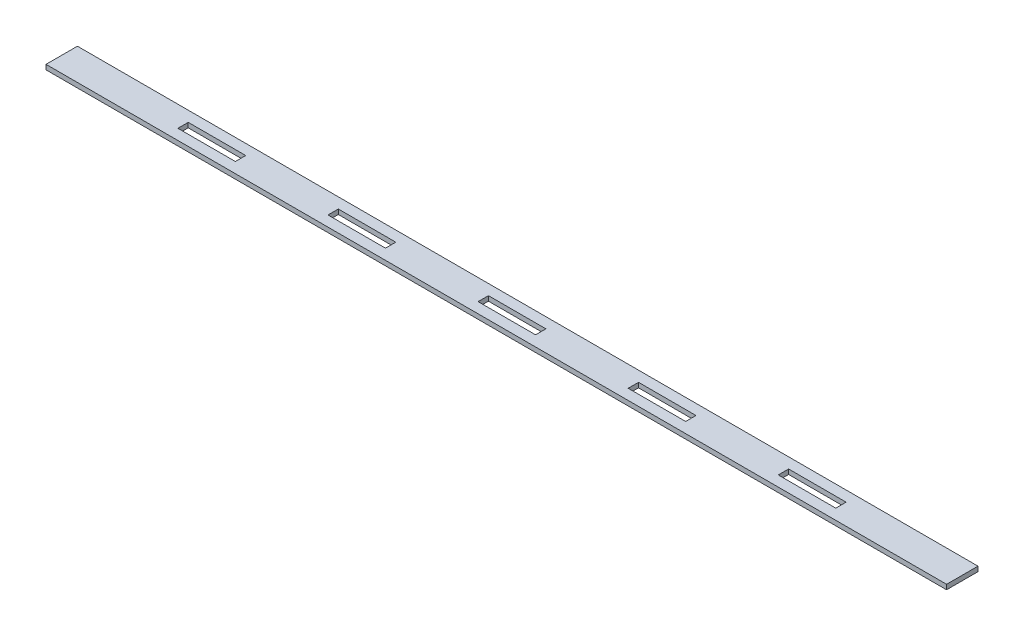
ISO-10303-21;
HEADER;
FILE_DESCRIPTION(('STEP AP214'),'2;1');
FILE_NAME('part.step','',(''),(''),'','','');
FILE_SCHEMA(('AUTOMOTIVE_DESIGN { 1 0 10303 214 1 1 1 1 }'));
ENDSEC;
DATA;
#1=APPLICATION_CONTEXT('core data for automotive mechanical design processes');
#2=APPLICATION_PROTOCOL_DEFINITION('international standard','automotive_design',2000,#1);
#3=PRODUCT_CONTEXT('',#1,'mechanical');
#4=PRODUCT('Part','Part','',(#3));
#5=PRODUCT_RELATED_PRODUCT_CATEGORY('part','',(#4));
#6=PRODUCT_DEFINITION_FORMATION('','',#4);
#7=PRODUCT_DEFINITION_CONTEXT('part definition',#1,'design');
#8=PRODUCT_DEFINITION('design','',#6,#7);
#9=PRODUCT_DEFINITION_SHAPE('','',#8);
#10=(LENGTH_UNIT() NAMED_UNIT(*) SI_UNIT(.MILLI.,.METRE.));
#11=(NAMED_UNIT(*) PLANE_ANGLE_UNIT() SI_UNIT($,.RADIAN.));
#12=(NAMED_UNIT(*) SI_UNIT($,.STERADIAN.) SOLID_ANGLE_UNIT());
#13=UNCERTAINTY_MEASURE_WITH_UNIT(LENGTH_MEASURE(1.E-05),#10,'distance_accuracy_value','');
#14=(GEOMETRIC_REPRESENTATION_CONTEXT(3) GLOBAL_UNCERTAINTY_ASSIGNED_CONTEXT((#13)) GLOBAL_UNIT_ASSIGNED_CONTEXT((#10,
#11,#12)) REPRESENTATION_CONTEXT('',''));
#15=CARTESIAN_POINT('',(0.,0.,0.));
#16=DIRECTION('',(0.,0.,1.));
#17=DIRECTION('',(1.,0.,0.));
#18=AXIS2_PLACEMENT_3D('',#15,#16,#17);
#19=CARTESIAN_POINT('',(-298.45,3.175,10.414));
#20=DIRECTION('',(1.,0.,0.));
#21=DIRECTION('',(0.,0.,-1.));
#22=AXIS2_PLACEMENT_3D('',#19,#20,#21);
#23=PLANE('',#22);
#24=DIRECTION('',(0.,0.,1.));
#25=VECTOR('',#24,1.);
#26=CARTESIAN_POINT('',(-298.45,0.,10.414));
#27=LINE('',#26,#25);
#28=CARTESIAN_POINT('',(-298.45,0.,-10.414));
#29=VERTEX_POINT('',#28);
#30=CARTESIAN_POINT('',(-298.45,0.,10.414));
#31=VERTEX_POINT('',#30);
#32=EDGE_CURVE('E251',#29,#31,#27,.T.);
#33=ORIENTED_EDGE('',*,*,#32,.T.);
#34=DIRECTION('',(0.,-1.,0.));
#35=VECTOR('',#34,1.);
#36=CARTESIAN_POINT('',(-298.45,3.175,10.414));
#37=LINE('',#36,#35);
#38=CARTESIAN_POINT('',(-298.45,3.175,10.414));
#39=VERTEX_POINT('',#38);
#40=EDGE_CURVE('E11',#39,#31,#37,.T.);
#41=ORIENTED_EDGE('',*,*,#40,.F.);
#42=DIRECTION('',(0.,0.,1.));
#43=VECTOR('',#42,1.);
#44=CARTESIAN_POINT('',(-298.45,3.175,10.414));
#45=LINE('',#44,#43);
#46=CARTESIAN_POINT('',(-298.45,3.175,-10.414));
#47=VERTEX_POINT('',#46);
#48=EDGE_CURVE('E430',#47,#39,#45,.T.);
#49=ORIENTED_EDGE('',*,*,#48,.F.);
#50=DIRECTION('',(0.,-1.,0.));
#51=VECTOR('',#50,1.);
#52=CARTESIAN_POINT('',(-298.45,3.175,-10.414));
#53=LINE('',#52,#51);
#54=EDGE_CURVE('E444',#47,#29,#53,.T.);
#55=ORIENTED_EDGE('',*,*,#54,.T.);
#56=EDGE_LOOP('',(#33,#41,#49,#55));
#57=FACE_BOUND('',#56,.T.);
#58=ADVANCED_FACE('F43',(#57),#23,.F.);
#59=CARTESIAN_POINT('',(298.45,3.175,10.414));
#60=DIRECTION('',(0.,0.,-1.));
#61=DIRECTION('',(-1.,0.,0.));
#62=AXIS2_PLACEMENT_3D('',#59,#60,#61);
#63=PLANE('',#62);
#64=DIRECTION('',(1.,0.,0.));
#65=VECTOR('',#64,1.);
#66=CARTESIAN_POINT('',(298.45,0.,10.414));
#67=LINE('',#66,#65);
#68=CARTESIAN_POINT('',(298.45,0.,10.414));
#69=VERTEX_POINT('',#68);
#70=EDGE_CURVE('E448',#31,#69,#67,.T.);
#71=ORIENTED_EDGE('',*,*,#70,.T.);
#72=DIRECTION('',(0.,-1.,0.));
#73=VECTOR('',#72,1.);
#74=CARTESIAN_POINT('',(298.45,3.175,10.414));
#75=LINE('',#74,#73);
#76=CARTESIAN_POINT('',(298.45,3.175,10.414));
#77=VERTEX_POINT('',#76);
#78=EDGE_CURVE('E51',#77,#69,#75,.T.);
#79=ORIENTED_EDGE('',*,*,#78,.F.);
#80=DIRECTION('',(1.,0.,0.));
#81=VECTOR('',#80,1.);
#82=CARTESIAN_POINT('',(298.45,3.175,10.414));
#83=LINE('',#82,#81);
#84=EDGE_CURVE('E434',#39,#77,#83,.T.);
#85=ORIENTED_EDGE('',*,*,#84,.F.);
#86=ORIENTED_EDGE('',*,*,#40,.T.);
#87=EDGE_LOOP('',(#71,#79,#85,#86));
#88=FACE_BOUND('',#87,.T.);
#89=ADVANCED_FACE('F483',(#88),#63,.F.);
#90=CARTESIAN_POINT('',(298.45,3.175,10.414));
#91=DIRECTION('',(-1.,0.,0.));
#92=DIRECTION('',(0.,0.,1.));
#93=AXIS2_PLACEMENT_3D('',#90,#91,#92);
#94=PLANE('',#93);
#95=DIRECTION('',(0.,0.,-1.));
#96=VECTOR('',#95,1.);
#97=CARTESIAN_POINT('',(298.45,0.,10.414));
#98=LINE('',#97,#96);
#99=CARTESIAN_POINT('',(298.45,0.,-10.414));
#100=VERTEX_POINT('',#99);
#101=EDGE_CURVE('E451',#69,#100,#98,.T.);
#102=ORIENTED_EDGE('',*,*,#101,.T.);
#103=DIRECTION('',(0.,-1.,0.));
#104=VECTOR('',#103,1.);
#105=CARTESIAN_POINT('',(298.45,3.175,-10.414));
#106=LINE('',#105,#104);
#107=CARTESIAN_POINT('',(298.45,3.175,-10.414));
#108=VERTEX_POINT('',#107);
#109=EDGE_CURVE('E459',#108,#100,#106,.T.);
#110=ORIENTED_EDGE('',*,*,#109,.F.);
#111=DIRECTION('',(0.,0.,-1.));
#112=VECTOR('',#111,1.);
#113=CARTESIAN_POINT('',(298.45,3.175,10.414));
#114=LINE('',#113,#112);
#115=EDGE_CURVE('E438',#77,#108,#114,.T.);
#116=ORIENTED_EDGE('',*,*,#115,.F.);
#117=ORIENTED_EDGE('',*,*,#78,.T.);
#118=EDGE_LOOP('',(#102,#110,#116,#117));
#119=FACE_BOUND('',#118,.T.);
#120=ADVANCED_FACE('F468',(#119),#94,.F.);
#121=CARTESIAN_POINT('',(298.45,3.175,-10.414));
#122=DIRECTION('',(0.,0.,1.));
#123=DIRECTION('',(1.,0.,0.));
#124=AXIS2_PLACEMENT_3D('',#121,#122,#123);
#125=PLANE('',#124);
#126=DIRECTION('',(-1.,0.,0.));
#127=VECTOR('',#126,1.);
#128=CARTESIAN_POINT('',(298.45,0.,-10.414));
#129=LINE('',#128,#127);
#130=EDGE_CURVE('E435',#100,#29,#129,.T.);
#131=ORIENTED_EDGE('',*,*,#130,.T.);
#132=ORIENTED_EDGE('',*,*,#54,.F.);
#133=DIRECTION('',(-1.,0.,0.));
#134=VECTOR('',#133,1.);
#135=CARTESIAN_POINT('',(298.45,3.175,-10.414));
#136=LINE('',#135,#134);
#137=EDGE_CURVE('E441',#108,#47,#136,.T.);
#138=ORIENTED_EDGE('',*,*,#137,.F.);
#139=ORIENTED_EDGE('',*,*,#109,.T.);
#140=EDGE_LOOP('',(#131,#132,#138,#139));
#141=FACE_BOUND('',#140,.T.);
#142=ADVANCED_FACE('F476',(#141),#125,.F.);
#143=CARTESIAN_POINT('',(0.,3.175,0.));
#144=DIRECTION('',(0.,1.,0.));
#145=DIRECTION('',(0.,0.,1.));
#146=AXIS2_PLACEMENT_3D('',#143,#144,#145);
#147=PLANE('',#146);
#148=DIRECTION('',(0.,0.,-1.));
#149=VECTOR('',#148,1.);
#150=CARTESIAN_POINT('',(-179.916666582,3.175,3.429));
#151=LINE('',#150,#149);
#152=CARTESIAN_POINT('',(-179.916666582,3.175,3.429));
#153=VERTEX_POINT('',#152);
#154=CARTESIAN_POINT('',(-179.916666582,3.175,-3.429));
#155=VERTEX_POINT('',#154);
#156=EDGE_CURVE('E58',#153,#155,#151,.T.);
#157=ORIENTED_EDGE('',*,*,#156,.F.);
#158=DIRECTION('',(1.,0.,0.));
#159=VECTOR('',#158,1.);
#160=CARTESIAN_POINT('',(-218.016666582,3.175,3.429));
#161=LINE('',#160,#159);
#162=CARTESIAN_POINT('',(-218.016666582,3.175,3.429));
#163=VERTEX_POINT('',#162);
#164=EDGE_CURVE('E228',#163,#153,#161,.T.);
#165=ORIENTED_EDGE('',*,*,#164,.F.);
#166=DIRECTION('',(0.,0.,1.));
#167=VECTOR('',#166,1.);
#168=CARTESIAN_POINT('',(-218.016666582,3.175,3.429));
#169=LINE('',#168,#167);
#170=CARTESIAN_POINT('',(-218.016666582,3.175,-3.429));
#171=VERTEX_POINT('',#170);
#172=EDGE_CURVE('E232',#171,#163,#169,.T.);
#173=ORIENTED_EDGE('',*,*,#172,.F.);
#174=DIRECTION('',(-1.,0.,0.));
#175=VECTOR('',#174,1.);
#176=CARTESIAN_POINT('',(-218.016666582,3.175,-3.429));
#177=LINE('',#176,#175);
#178=EDGE_CURVE('E241',#155,#171,#177,.T.);
#179=ORIENTED_EDGE('',*,*,#178,.F.);
#180=EDGE_LOOP('',(#157,#165,#173,#179));
#181=FACE_BOUND('',#180,.T.);
#182=DIRECTION('',(0.,0.,-1.));
#183=VECTOR('',#182,1.);
#184=CARTESIAN_POINT('',(-80.4333331640002,3.175,3.429));
#185=LINE('',#184,#183);
#186=CARTESIAN_POINT('',(-80.4333331640002,3.175,3.429));
#187=VERTEX_POINT('',#186);
#188=CARTESIAN_POINT('',(-80.4333331640001,3.175,-3.429));
#189=VERTEX_POINT('',#188);
#190=EDGE_CURVE('E66',#187,#189,#185,.T.);
#191=ORIENTED_EDGE('',*,*,#190,.F.);
#192=DIRECTION('',(1.,0.,0.));
#193=VECTOR('',#192,1.);
#194=CARTESIAN_POINT('',(-118.533333164,3.175,3.429));
#195=LINE('',#194,#193);
#196=CARTESIAN_POINT('',(-118.533333164,3.175,3.429));
#197=VERTEX_POINT('',#196);
#198=EDGE_CURVE('E262',#197,#187,#195,.T.);
#199=ORIENTED_EDGE('',*,*,#198,.F.);
#200=DIRECTION('',(0.,0.,1.));
#201=VECTOR('',#200,1.);
#202=CARTESIAN_POINT('',(-118.533333164,3.175,3.429));
#203=LINE('',#202,#201);
#204=CARTESIAN_POINT('',(-118.533333164,3.175,-3.429));
#205=VERTEX_POINT('',#204);
#206=EDGE_CURVE('E282',#205,#197,#203,.T.);
#207=ORIENTED_EDGE('',*,*,#206,.F.);
#208=DIRECTION('',(-1.,0.,0.));
#209=VECTOR('',#208,1.);
#210=CARTESIAN_POINT('',(-118.533333164,3.175,-3.429));
#211=LINE('',#210,#209);
#212=EDGE_CURVE('E277',#189,#205,#211,.T.);
#213=ORIENTED_EDGE('',*,*,#212,.F.);
#214=EDGE_LOOP('',(#191,#199,#207,#213));
#215=FACE_BOUND('',#214,.T.);
#216=DIRECTION('',(0.,0.,-1.));
#217=VECTOR('',#216,1.);
#218=CARTESIAN_POINT('',(19.0500001693332,3.175,3.429));
#219=LINE('',#218,#217);
#220=CARTESIAN_POINT('',(19.0500001693332,3.175,3.429));
#221=VERTEX_POINT('',#220);
#222=CARTESIAN_POINT('',(19.0500001693332,3.175,-3.429));
#223=VERTEX_POINT('',#222);
#224=EDGE_CURVE('E317',#221,#223,#219,.T.);
#225=ORIENTED_EDGE('',*,*,#224,.F.);
#226=DIRECTION('',(1.,0.,0.));
#227=VECTOR('',#226,1.);
#228=CARTESIAN_POINT('',(-19.0499998306668,3.175,3.429));
#229=LINE('',#228,#227);
#230=CARTESIAN_POINT('',(-19.0499998306668,3.175,3.429));
#231=VERTEX_POINT('',#230);
#232=EDGE_CURVE('E304',#231,#221,#229,.T.);
#233=ORIENTED_EDGE('',*,*,#232,.F.);
#234=DIRECTION('',(0.,0.,1.));
#235=VECTOR('',#234,1.);
#236=CARTESIAN_POINT('',(-19.0499998306668,3.175,3.429));
#237=LINE('',#236,#235);
#238=CARTESIAN_POINT('',(-19.0499998306668,3.175,-3.429));
#239=VERTEX_POINT('',#238);
#240=EDGE_CURVE('E325',#239,#231,#237,.T.);
#241=ORIENTED_EDGE('',*,*,#240,.F.);
#242=DIRECTION('',(-1.,0.,0.));
#243=VECTOR('',#242,1.);
#244=CARTESIAN_POINT('',(-19.0499998306668,3.175,-3.429));
#245=LINE('',#244,#243);
#246=EDGE_CURVE('E320',#223,#239,#245,.T.);
#247=ORIENTED_EDGE('',*,*,#246,.F.);
#248=EDGE_LOOP('',(#225,#233,#241,#247));
#249=FACE_BOUND('',#248,.T.);
#250=DIRECTION('',(0.,0.,-1.));
#251=VECTOR('',#250,1.);
#252=CARTESIAN_POINT('',(118.533333333333,3.175,3.42899999999999));
#253=LINE('',#252,#251);
#254=CARTESIAN_POINT('',(118.533333333333,3.175,3.42899999999999));
#255=VERTEX_POINT('',#254);
#256=CARTESIAN_POINT('',(118.533333333333,3.175,-3.42900000000001));
#257=VERTEX_POINT('',#256);
#258=EDGE_CURVE('E361',#255,#257,#253,.T.);
#259=ORIENTED_EDGE('',*,*,#258,.F.);
#260=DIRECTION('',(1.,0.,0.));
#261=VECTOR('',#260,1.);
#262=CARTESIAN_POINT('',(80.4333333333333,3.175,3.429));
#263=LINE('',#262,#261);
#264=CARTESIAN_POINT('',(80.4333333333333,3.175,3.429));
#265=VERTEX_POINT('',#264);
#266=EDGE_CURVE('E348',#265,#255,#263,.T.);
#267=ORIENTED_EDGE('',*,*,#266,.F.);
#268=DIRECTION('',(0.,0.,1.));
#269=VECTOR('',#268,1.);
#270=CARTESIAN_POINT('',(80.4333333333333,3.175,3.429));
#271=LINE('',#270,#269);
#272=CARTESIAN_POINT('',(80.4333333333333,3.175,-3.429));
#273=VERTEX_POINT('',#272);
#274=EDGE_CURVE('E369',#273,#265,#271,.T.);
#275=ORIENTED_EDGE('',*,*,#274,.F.);
#276=DIRECTION('',(-1.,0.,0.));
#277=VECTOR('',#276,1.);
#278=CARTESIAN_POINT('',(80.4333333333333,3.175,-3.429));
#279=LINE('',#278,#277);
#280=EDGE_CURVE('E364',#257,#273,#279,.T.);
#281=ORIENTED_EDGE('',*,*,#280,.F.);
#282=EDGE_LOOP('',(#259,#267,#275,#281));
#283=FACE_BOUND('',#282,.T.);
#284=DIRECTION('',(0.,0.,-1.));
#285=VECTOR('',#284,1.);
#286=CARTESIAN_POINT('',(218.016666666667,3.175,3.42899999999999));
#287=LINE('',#286,#285);
#288=CARTESIAN_POINT('',(218.016666666667,3.175,3.42899999999999));
#289=VERTEX_POINT('',#288);
#290=CARTESIAN_POINT('',(218.016666666667,3.175,-3.42900000000001));
#291=VERTEX_POINT('',#290);
#292=EDGE_CURVE('E405',#289,#291,#287,.T.);
#293=ORIENTED_EDGE('',*,*,#292,.F.);
#294=DIRECTION('',(1.,0.,0.));
#295=VECTOR('',#294,1.);
#296=CARTESIAN_POINT('',(179.916666666667,3.175,3.42899999999999));
#297=LINE('',#296,#295);
#298=CARTESIAN_POINT('',(179.916666666667,3.175,3.42899999999999));
#299=VERTEX_POINT('',#298);
#300=EDGE_CURVE('E392',#299,#289,#297,.T.);
#301=ORIENTED_EDGE('',*,*,#300,.F.);
#302=DIRECTION('',(0.,0.,1.));
#303=VECTOR('',#302,1.);
#304=CARTESIAN_POINT('',(179.916666666667,3.175,3.42899999999999));
#305=LINE('',#304,#303);
#306=CARTESIAN_POINT('',(179.916666666667,3.175,-3.42900000000001));
#307=VERTEX_POINT('',#306);
#308=EDGE_CURVE('E412',#307,#299,#305,.T.);
#309=ORIENTED_EDGE('',*,*,#308,.F.);
#310=DIRECTION('',(-1.,0.,0.));
#311=VECTOR('',#310,1.);
#312=CARTESIAN_POINT('',(179.916666666667,3.175,-3.42900000000001));
#313=LINE('',#312,#311);
#314=EDGE_CURVE('E408',#291,#307,#313,.T.);
#315=ORIENTED_EDGE('',*,*,#314,.F.);
#316=EDGE_LOOP('',(#293,#301,#309,#315));
#317=FACE_BOUND('',#316,.T.);
#318=ORIENTED_EDGE('',*,*,#48,.T.);
#319=ORIENTED_EDGE('',*,*,#84,.T.);
#320=ORIENTED_EDGE('',*,*,#115,.T.);
#321=ORIENTED_EDGE('',*,*,#137,.T.);
#322=EDGE_LOOP('',(#318,#319,#320,#321));
#323=FACE_BOUND('',#322,.T.);
#324=ADVANCED_FACE('F482',(#181,#215,#249,#283,#317,#323),#147,.T.);
#325=CARTESIAN_POINT('',(0.,0.,0.));
#326=DIRECTION('',(0.,1.,0.));
#327=DIRECTION('',(0.,0.,1.));
#328=AXIS2_PLACEMENT_3D('',#325,#326,#327);
#329=PLANE('',#328);
#330=DIRECTION('',(1.,0.,0.));
#331=VECTOR('',#330,1.);
#332=CARTESIAN_POINT('',(-218.016666582,0.,3.429));
#333=LINE('',#332,#331);
#334=CARTESIAN_POINT('',(-218.016666582,0.,3.429));
#335=VERTEX_POINT('',#334);
#336=CARTESIAN_POINT('',(-179.916666582,0.,3.429));
#337=VERTEX_POINT('',#336);
#338=EDGE_CURVE('E213',#335,#337,#333,.T.);
#339=ORIENTED_EDGE('',*,*,#338,.T.);
#340=DIRECTION('',(0.,0.,-1.));
#341=VECTOR('',#340,1.);
#342=CARTESIAN_POINT('',(-179.916666582,0.,3.429));
#343=LINE('',#342,#341);
#344=CARTESIAN_POINT('',(-179.916666582,0.,-3.429));
#345=VERTEX_POINT('',#344);
#346=EDGE_CURVE('E206',#337,#345,#343,.T.);
#347=ORIENTED_EDGE('',*,*,#346,.T.);
#348=DIRECTION('',(-1.,0.,0.));
#349=VECTOR('',#348,1.);
#350=CARTESIAN_POINT('',(-218.016666582,0.,-3.429));
#351=LINE('',#350,#349);
#352=CARTESIAN_POINT('',(-218.016666582,0.,-3.429));
#353=VERTEX_POINT('',#352);
#354=EDGE_CURVE('E217',#345,#353,#351,.T.);
#355=ORIENTED_EDGE('',*,*,#354,.T.);
#356=DIRECTION('',(0.,0.,1.));
#357=VECTOR('',#356,1.);
#358=CARTESIAN_POINT('',(-218.016666582,0.,3.429));
#359=LINE('',#358,#357);
#360=EDGE_CURVE('E222',#353,#335,#359,.T.);
#361=ORIENTED_EDGE('',*,*,#360,.T.);
#362=EDGE_LOOP('',(#339,#347,#355,#361));
#363=FACE_BOUND('',#362,.T.);
#364=DIRECTION('',(1.,0.,0.));
#365=VECTOR('',#364,1.);
#366=CARTESIAN_POINT('',(-118.533333164,0.,3.429));
#367=LINE('',#366,#365);
#368=CARTESIAN_POINT('',(-118.533333164,0.,3.429));
#369=VERTEX_POINT('',#368);
#370=CARTESIAN_POINT('',(-80.4333331640002,0.,3.429));
#371=VERTEX_POINT('',#370);
#372=EDGE_CURVE('E270',#369,#371,#367,.T.);
#373=ORIENTED_EDGE('',*,*,#372,.T.);
#374=DIRECTION('',(0.,0.,-1.));
#375=VECTOR('',#374,1.);
#376=CARTESIAN_POINT('',(-80.4333331640002,0.,3.429));
#377=LINE('',#376,#375);
#378=CARTESIAN_POINT('',(-80.4333331640001,0.,-3.429));
#379=VERTEX_POINT('',#378);
#380=EDGE_CURVE('E257',#371,#379,#377,.T.);
#381=ORIENTED_EDGE('',*,*,#380,.T.);
#382=DIRECTION('',(-1.,0.,0.));
#383=VECTOR('',#382,1.);
#384=CARTESIAN_POINT('',(-118.533333164,0.,-3.429));
#385=LINE('',#384,#383);
#386=CARTESIAN_POINT('',(-118.533333164,0.,-3.429));
#387=VERTEX_POINT('',#386);
#388=EDGE_CURVE('E261',#379,#387,#385,.T.);
#389=ORIENTED_EDGE('',*,*,#388,.T.);
#390=DIRECTION('',(0.,0.,1.));
#391=VECTOR('',#390,1.);
#392=CARTESIAN_POINT('',(-118.533333164,0.,3.429));
#393=LINE('',#392,#391);
#394=EDGE_CURVE('E266',#387,#369,#393,.T.);
#395=ORIENTED_EDGE('',*,*,#394,.T.);
#396=EDGE_LOOP('',(#373,#381,#389,#395));
#397=FACE_BOUND('',#396,.T.);
#398=DIRECTION('',(1.,0.,0.));
#399=VECTOR('',#398,1.);
#400=CARTESIAN_POINT('',(-19.0499998306668,0.,3.429));
#401=LINE('',#400,#399);
#402=CARTESIAN_POINT('',(-19.0499998306668,0.,3.429));
#403=VERTEX_POINT('',#402);
#404=CARTESIAN_POINT('',(19.0500001693332,0.,3.429));
#405=VERTEX_POINT('',#404);
#406=EDGE_CURVE('E312',#403,#405,#401,.T.);
#407=ORIENTED_EDGE('',*,*,#406,.T.);
#408=DIRECTION('',(0.,0.,-1.));
#409=VECTOR('',#408,1.);
#410=CARTESIAN_POINT('',(19.0500001693332,0.,3.429));
#411=LINE('',#410,#409);
#412=CARTESIAN_POINT('',(19.0500001693332,0.,-3.429));
#413=VERTEX_POINT('',#412);
#414=EDGE_CURVE('E299',#405,#413,#411,.T.);
#415=ORIENTED_EDGE('',*,*,#414,.T.);
#416=DIRECTION('',(-1.,0.,0.));
#417=VECTOR('',#416,1.);
#418=CARTESIAN_POINT('',(-19.0499998306668,0.,-3.429));
#419=LINE('',#418,#417);
#420=CARTESIAN_POINT('',(-19.0499998306668,0.,-3.429));
#421=VERTEX_POINT('',#420);
#422=EDGE_CURVE('E303',#413,#421,#419,.T.);
#423=ORIENTED_EDGE('',*,*,#422,.T.);
#424=DIRECTION('',(0.,0.,1.));
#425=VECTOR('',#424,1.);
#426=CARTESIAN_POINT('',(-19.0499998306668,0.,3.429));
#427=LINE('',#426,#425);
#428=EDGE_CURVE('E308',#421,#403,#427,.T.);
#429=ORIENTED_EDGE('',*,*,#428,.T.);
#430=EDGE_LOOP('',(#407,#415,#423,#429));
#431=FACE_BOUND('',#430,.T.);
#432=DIRECTION('',(1.,0.,0.));
#433=VECTOR('',#432,1.);
#434=CARTESIAN_POINT('',(80.4333333333333,0.,3.429));
#435=LINE('',#434,#433);
#436=CARTESIAN_POINT('',(80.4333333333333,0.,3.429));
#437=VERTEX_POINT('',#436);
#438=CARTESIAN_POINT('',(118.533333333333,0.,3.42899999999999));
#439=VERTEX_POINT('',#438);
#440=EDGE_CURVE('E356',#437,#439,#435,.T.);
#441=ORIENTED_EDGE('',*,*,#440,.T.);
#442=DIRECTION('',(0.,0.,-1.));
#443=VECTOR('',#442,1.);
#444=CARTESIAN_POINT('',(118.533333333333,0.,3.42899999999999));
#445=LINE('',#444,#443);
#446=CARTESIAN_POINT('',(118.533333333333,0.,-3.42900000000001));
#447=VERTEX_POINT('',#446);
#448=EDGE_CURVE('E343',#439,#447,#445,.T.);
#449=ORIENTED_EDGE('',*,*,#448,.T.);
#450=DIRECTION('',(-1.,0.,0.));
#451=VECTOR('',#450,1.);
#452=CARTESIAN_POINT('',(80.4333333333333,0.,-3.429));
#453=LINE('',#452,#451);
#454=CARTESIAN_POINT('',(80.4333333333333,0.,-3.429));
#455=VERTEX_POINT('',#454);
#456=EDGE_CURVE('E347',#447,#455,#453,.T.);
#457=ORIENTED_EDGE('',*,*,#456,.T.);
#458=DIRECTION('',(0.,0.,1.));
#459=VECTOR('',#458,1.);
#460=CARTESIAN_POINT('',(80.4333333333333,0.,3.429));
#461=LINE('',#460,#459);
#462=EDGE_CURVE('E352',#455,#437,#461,.T.);
#463=ORIENTED_EDGE('',*,*,#462,.T.);
#464=EDGE_LOOP('',(#441,#449,#457,#463));
#465=FACE_BOUND('',#464,.T.);
#466=DIRECTION('',(1.,0.,0.));
#467=VECTOR('',#466,1.);
#468=CARTESIAN_POINT('',(179.916666666667,0.,3.42899999999999));
#469=LINE('',#468,#467);
#470=CARTESIAN_POINT('',(179.916666666667,0.,3.42899999999999));
#471=VERTEX_POINT('',#470);
#472=CARTESIAN_POINT('',(218.016666666667,0.,3.42899999999999));
#473=VERTEX_POINT('',#472);
#474=EDGE_CURVE('E400',#471,#473,#469,.T.);
#475=ORIENTED_EDGE('',*,*,#474,.T.);
#476=DIRECTION('',(0.,0.,-1.));
#477=VECTOR('',#476,1.);
#478=CARTESIAN_POINT('',(218.016666666667,0.,3.42899999999999));
#479=LINE('',#478,#477);
#480=CARTESIAN_POINT('',(218.016666666667,0.,-3.42900000000001));
#481=VERTEX_POINT('',#480);
#482=EDGE_CURVE('E387',#473,#481,#479,.T.);
#483=ORIENTED_EDGE('',*,*,#482,.T.);
#484=DIRECTION('',(-1.,0.,0.));
#485=VECTOR('',#484,1.);
#486=CARTESIAN_POINT('',(179.916666666667,0.,-3.42900000000001));
#487=LINE('',#486,#485);
#488=CARTESIAN_POINT('',(179.916666666667,0.,-3.42900000000001));
#489=VERTEX_POINT('',#488);
#490=EDGE_CURVE('E391',#481,#489,#487,.T.);
#491=ORIENTED_EDGE('',*,*,#490,.T.);
#492=DIRECTION('',(0.,0.,1.));
#493=VECTOR('',#492,1.);
#494=CARTESIAN_POINT('',(179.916666666667,0.,3.42899999999999));
#495=LINE('',#494,#493);
#496=EDGE_CURVE('E396',#489,#471,#495,.T.);
#497=ORIENTED_EDGE('',*,*,#496,.T.);
#498=EDGE_LOOP('',(#475,#483,#491,#497));
#499=FACE_BOUND('',#498,.T.);
#500=ORIENTED_EDGE('',*,*,#32,.F.);
#501=ORIENTED_EDGE('',*,*,#130,.F.);
#502=ORIENTED_EDGE('',*,*,#101,.F.);
#503=ORIENTED_EDGE('',*,*,#70,.F.);
#504=EDGE_LOOP('',(#500,#501,#502,#503));
#505=FACE_BOUND('',#504,.T.);
#506=ADVANCED_FACE('F224',(#363,#397,#431,#465,#499,#505),#329,.F.);
#507=CARTESIAN_POINT('',(218.016666666667,0.,3.42899999999999));
#508=DIRECTION('',(1.,0.,0.));
#509=DIRECTION('',(0.,0.,-1.));
#510=AXIS2_PLACEMENT_3D('',#507,#508,#509);
#511=PLANE('',#510);
#512=ORIENTED_EDGE('',*,*,#292,.T.);
#513=DIRECTION('',(0.,1.,0.));
#514=VECTOR('',#513,1.);
#515=CARTESIAN_POINT('',(218.016666666667,0.,-3.42900000000001));
#516=LINE('',#515,#514);
#517=EDGE_CURVE('E404',#481,#291,#516,.T.);
#518=ORIENTED_EDGE('',*,*,#517,.F.);
#519=ORIENTED_EDGE('',*,*,#482,.F.);
#520=DIRECTION('',(0.,1.,0.));
#521=VECTOR('',#520,1.);
#522=CARTESIAN_POINT('',(218.016666666667,0.,3.42899999999999));
#523=LINE('',#522,#521);
#524=EDGE_CURVE('E365',#473,#289,#523,.T.);
#525=ORIENTED_EDGE('',*,*,#524,.T.);
#526=EDGE_LOOP('',(#512,#518,#519,#525));
#527=FACE_BOUND('',#526,.T.);
#528=ADVANCED_FACE('F495',(#527),#511,.F.);
#529=CARTESIAN_POINT('',(179.916666666667,0.,3.42899999999999));
#530=DIRECTION('',(0.,0.,1.));
#531=DIRECTION('',(1.,0.,0.));
#532=AXIS2_PLACEMENT_3D('',#529,#530,#531);
#533=PLANE('',#532);
#534=ORIENTED_EDGE('',*,*,#300,.T.);
#535=ORIENTED_EDGE('',*,*,#524,.F.);
#536=ORIENTED_EDGE('',*,*,#474,.F.);
#537=DIRECTION('',(0.,1.,0.));
#538=VECTOR('',#537,1.);
#539=CARTESIAN_POINT('',(179.916666666667,0.,3.42899999999999));
#540=LINE('',#539,#538);
#541=EDGE_CURVE('E421',#471,#299,#540,.T.);
#542=ORIENTED_EDGE('',*,*,#541,.T.);
#543=EDGE_LOOP('',(#534,#535,#536,#542));
#544=FACE_BOUND('',#543,.T.);
#545=ADVANCED_FACE('F501',(#544),#533,.F.);
#546=CARTESIAN_POINT('',(179.916666666667,0.,3.42899999999999));
#547=DIRECTION('',(-1.,0.,0.));
#548=DIRECTION('',(0.,0.,1.));
#549=AXIS2_PLACEMENT_3D('',#546,#547,#548);
#550=PLANE('',#549);
#551=ORIENTED_EDGE('',*,*,#308,.T.);
#552=ORIENTED_EDGE('',*,*,#541,.F.);
#553=ORIENTED_EDGE('',*,*,#496,.F.);
#554=DIRECTION('',(0.,1.,0.));
#555=VECTOR('',#554,1.);
#556=CARTESIAN_POINT('',(179.916666666667,0.,-3.42900000000001));
#557=LINE('',#556,#555);
#558=EDGE_CURVE('E424',#489,#307,#557,.T.);
#559=ORIENTED_EDGE('',*,*,#558,.T.);
#560=EDGE_LOOP('',(#551,#552,#553,#559));
#561=FACE_BOUND('',#560,.T.);
#562=ADVANCED_FACE('F507',(#561),#550,.F.);
#563=CARTESIAN_POINT('',(179.916666666667,0.,-3.42900000000001));
#564=DIRECTION('',(0.,0.,-1.));
#565=DIRECTION('',(-1.,0.,0.));
#566=AXIS2_PLACEMENT_3D('',#563,#564,#565);
#567=PLANE('',#566);
#568=ORIENTED_EDGE('',*,*,#314,.T.);
#569=ORIENTED_EDGE('',*,*,#558,.F.);
#570=ORIENTED_EDGE('',*,*,#490,.F.);
#571=ORIENTED_EDGE('',*,*,#517,.T.);
#572=EDGE_LOOP('',(#568,#569,#570,#571));
#573=FACE_BOUND('',#572,.T.);
#574=ADVANCED_FACE('F503',(#573),#567,.F.);
#575=CARTESIAN_POINT('',(118.533333333333,0.,3.42899999999999));
#576=DIRECTION('',(1.,0.,0.));
#577=DIRECTION('',(0.,0.,-1.));
#578=AXIS2_PLACEMENT_3D('',#575,#576,#577);
#579=PLANE('',#578);
#580=ORIENTED_EDGE('',*,*,#258,.T.);
#581=DIRECTION('',(0.,1.,0.));
#582=VECTOR('',#581,1.);
#583=CARTESIAN_POINT('',(118.533333333333,0.,-3.42900000000001));
#584=LINE('',#583,#582);
#585=EDGE_CURVE('E360',#447,#257,#584,.T.);
#586=ORIENTED_EDGE('',*,*,#585,.F.);
#587=ORIENTED_EDGE('',*,*,#448,.F.);
#588=DIRECTION('',(0.,1.,0.));
#589=VECTOR('',#588,1.);
#590=CARTESIAN_POINT('',(118.533333333333,0.,3.42899999999999));
#591=LINE('',#590,#589);
#592=EDGE_CURVE('E321',#439,#255,#591,.T.);
#593=ORIENTED_EDGE('',*,*,#592,.T.);
#594=EDGE_LOOP('',(#580,#586,#587,#593));
#595=FACE_BOUND('',#594,.T.);
#596=ADVANCED_FACE('F506',(#595),#579,.F.);
#597=CARTESIAN_POINT('',(80.4333333333333,0.,3.429));
#598=DIRECTION('',(0.,0.,1.));
#599=DIRECTION('',(1.,0.,0.));
#600=AXIS2_PLACEMENT_3D('',#597,#598,#599);
#601=PLANE('',#600);
#602=ORIENTED_EDGE('',*,*,#266,.T.);
#603=ORIENTED_EDGE('',*,*,#592,.F.);
#604=ORIENTED_EDGE('',*,*,#440,.F.);
#605=DIRECTION('',(0.,1.,0.));
#606=VECTOR('',#605,1.);
#607=CARTESIAN_POINT('',(80.4333333333333,0.,3.429));
#608=LINE('',#607,#606);
#609=EDGE_CURVE('E378',#437,#265,#608,.T.);
#610=ORIENTED_EDGE('',*,*,#609,.T.);
#611=EDGE_LOOP('',(#602,#603,#604,#610));
#612=FACE_BOUND('',#611,.T.);
#613=ADVANCED_FACE('F517',(#612),#601,.F.);
#614=CARTESIAN_POINT('',(80.4333333333333,0.,3.429));
#615=DIRECTION('',(-1.,0.,0.));
#616=DIRECTION('',(0.,0.,1.));
#617=AXIS2_PLACEMENT_3D('',#614,#615,#616);
#618=PLANE('',#617);
#619=ORIENTED_EDGE('',*,*,#274,.T.);
#620=ORIENTED_EDGE('',*,*,#609,.F.);
#621=ORIENTED_EDGE('',*,*,#462,.F.);
#622=DIRECTION('',(0.,1.,0.));
#623=VECTOR('',#622,1.);
#624=CARTESIAN_POINT('',(80.4333333333333,0.,-3.429));
#625=LINE('',#624,#623);
#626=EDGE_CURVE('E381',#455,#273,#625,.T.);
#627=ORIENTED_EDGE('',*,*,#626,.T.);
#628=EDGE_LOOP('',(#619,#620,#621,#627));
#629=FACE_BOUND('',#628,.T.);
#630=ADVANCED_FACE('F523',(#629),#618,.F.);
#631=CARTESIAN_POINT('',(80.4333333333333,0.,-3.429));
#632=DIRECTION('',(0.,0.,-1.));
#633=DIRECTION('',(-1.,0.,0.));
#634=AXIS2_PLACEMENT_3D('',#631,#632,#633);
#635=PLANE('',#634);
#636=ORIENTED_EDGE('',*,*,#280,.T.);
#637=ORIENTED_EDGE('',*,*,#626,.F.);
#638=ORIENTED_EDGE('',*,*,#456,.F.);
#639=ORIENTED_EDGE('',*,*,#585,.T.);
#640=EDGE_LOOP('',(#636,#637,#638,#639));
#641=FACE_BOUND('',#640,.T.);
#642=ADVANCED_FACE('F519',(#641),#635,.F.);
#643=CARTESIAN_POINT('',(19.0500001693332,0.,3.429));
#644=DIRECTION('',(1.,0.,0.));
#645=DIRECTION('',(0.,0.,-1.));
#646=AXIS2_PLACEMENT_3D('',#643,#644,#645);
#647=PLANE('',#646);
#648=ORIENTED_EDGE('',*,*,#224,.T.);
#649=DIRECTION('',(0.,1.,0.));
#650=VECTOR('',#649,1.);
#651=CARTESIAN_POINT('',(19.0500001693332,0.,-3.429));
#652=LINE('',#651,#650);
#653=EDGE_CURVE('E316',#413,#223,#652,.T.);
#654=ORIENTED_EDGE('',*,*,#653,.F.);
#655=ORIENTED_EDGE('',*,*,#414,.F.);
#656=DIRECTION('',(0.,1.,0.));
#657=VECTOR('',#656,1.);
#658=CARTESIAN_POINT('',(19.0500001693332,0.,3.429));
#659=LINE('',#658,#657);
#660=EDGE_CURVE('E278',#405,#221,#659,.T.);
#661=ORIENTED_EDGE('',*,*,#660,.T.);
#662=EDGE_LOOP('',(#648,#654,#655,#661));
#663=FACE_BOUND('',#662,.T.);
#664=ADVANCED_FACE('F522',(#663),#647,.F.);
#665=CARTESIAN_POINT('',(-19.0499998306668,0.,3.429));
#666=DIRECTION('',(0.,0.,1.));
#667=DIRECTION('',(1.,0.,0.));
#668=AXIS2_PLACEMENT_3D('',#665,#666,#667);
#669=PLANE('',#668);
#670=ORIENTED_EDGE('',*,*,#232,.T.);
#671=ORIENTED_EDGE('',*,*,#660,.F.);
#672=ORIENTED_EDGE('',*,*,#406,.F.);
#673=DIRECTION('',(0.,1.,0.));
#674=VECTOR('',#673,1.);
#675=CARTESIAN_POINT('',(-19.0499998306668,0.,3.429));
#676=LINE('',#675,#674);
#677=EDGE_CURVE('E334',#403,#231,#676,.T.);
#678=ORIENTED_EDGE('',*,*,#677,.T.);
#679=EDGE_LOOP('',(#670,#671,#672,#678));
#680=FACE_BOUND('',#679,.T.);
#681=ADVANCED_FACE('F533',(#680),#669,.F.);
#682=CARTESIAN_POINT('',(-19.0499998306668,0.,3.429));
#683=DIRECTION('',(-1.,0.,0.));
#684=DIRECTION('',(0.,0.,1.));
#685=AXIS2_PLACEMENT_3D('',#682,#683,#684);
#686=PLANE('',#685);
#687=ORIENTED_EDGE('',*,*,#240,.T.);
#688=ORIENTED_EDGE('',*,*,#677,.F.);
#689=ORIENTED_EDGE('',*,*,#428,.F.);
#690=DIRECTION('',(0.,1.,0.));
#691=VECTOR('',#690,1.);
#692=CARTESIAN_POINT('',(-19.0499998306668,0.,-3.429));
#693=LINE('',#692,#691);
#694=EDGE_CURVE('E337',#421,#239,#693,.T.);
#695=ORIENTED_EDGE('',*,*,#694,.T.);
#696=EDGE_LOOP('',(#687,#688,#689,#695));
#697=FACE_BOUND('',#696,.T.);
#698=ADVANCED_FACE('F539',(#697),#686,.F.);
#699=CARTESIAN_POINT('',(-19.0499998306668,0.,-3.429));
#700=DIRECTION('',(0.,0.,-1.));
#701=DIRECTION('',(-1.,0.,0.));
#702=AXIS2_PLACEMENT_3D('',#699,#700,#701);
#703=PLANE('',#702);
#704=ORIENTED_EDGE('',*,*,#246,.T.);
#705=ORIENTED_EDGE('',*,*,#694,.F.);
#706=ORIENTED_EDGE('',*,*,#422,.F.);
#707=ORIENTED_EDGE('',*,*,#653,.T.);
#708=EDGE_LOOP('',(#704,#705,#706,#707));
#709=FACE_BOUND('',#708,.T.);
#710=ADVANCED_FACE('F535',(#709),#703,.F.);
#711=CARTESIAN_POINT('',(-80.4333331640002,0.,3.429));
#712=DIRECTION('',(1.,0.,0.));
#713=DIRECTION('',(0.,0.,-1.));
#714=AXIS2_PLACEMENT_3D('',#711,#712,#713);
#715=PLANE('',#714);
#716=ORIENTED_EDGE('',*,*,#190,.T.);
#717=DIRECTION('',(0.,1.,0.));
#718=VECTOR('',#717,1.);
#719=CARTESIAN_POINT('',(-80.4333331640001,0.,-3.429));
#720=LINE('',#719,#718);
#721=EDGE_CURVE('E274',#379,#189,#720,.T.);
#722=ORIENTED_EDGE('',*,*,#721,.F.);
#723=ORIENTED_EDGE('',*,*,#380,.F.);
#724=DIRECTION('',(0.,1.,0.));
#725=VECTOR('',#724,1.);
#726=CARTESIAN_POINT('',(-80.4333331640002,0.,3.429));
#727=LINE('',#726,#725);
#728=EDGE_CURVE('E242',#371,#187,#727,.T.);
#729=ORIENTED_EDGE('',*,*,#728,.T.);
#730=EDGE_LOOP('',(#716,#722,#723,#729));
#731=FACE_BOUND('',#730,.T.);
#732=ADVANCED_FACE('F538',(#731),#715,.F.);
#733=CARTESIAN_POINT('',(-118.533333164,0.,3.429));
#734=DIRECTION('',(0.,0.,1.));
#735=DIRECTION('',(1.,0.,0.));
#736=AXIS2_PLACEMENT_3D('',#733,#734,#735);
#737=PLANE('',#736);
#738=ORIENTED_EDGE('',*,*,#198,.T.);
#739=ORIENTED_EDGE('',*,*,#728,.F.);
#740=ORIENTED_EDGE('',*,*,#372,.F.);
#741=DIRECTION('',(0.,1.,0.));
#742=VECTOR('',#741,1.);
#743=CARTESIAN_POINT('',(-118.533333164,0.,3.429));
#744=LINE('',#743,#742);
#745=EDGE_CURVE('E291',#369,#197,#744,.T.);
#746=ORIENTED_EDGE('',*,*,#745,.T.);
#747=EDGE_LOOP('',(#738,#739,#740,#746));
#748=FACE_BOUND('',#747,.T.);
#749=ADVANCED_FACE('F549',(#748),#737,.F.);
#750=CARTESIAN_POINT('',(-118.533333164,0.,3.429));
#751=DIRECTION('',(-1.,0.,0.));
#752=DIRECTION('',(0.,0.,1.));
#753=AXIS2_PLACEMENT_3D('',#750,#751,#752);
#754=PLANE('',#753);
#755=ORIENTED_EDGE('',*,*,#206,.T.);
#756=ORIENTED_EDGE('',*,*,#745,.F.);
#757=ORIENTED_EDGE('',*,*,#394,.F.);
#758=DIRECTION('',(0.,1.,0.));
#759=VECTOR('',#758,1.);
#760=CARTESIAN_POINT('',(-118.533333164,0.,-3.429));
#761=LINE('',#760,#759);
#762=EDGE_CURVE('E294',#387,#205,#761,.T.);
#763=ORIENTED_EDGE('',*,*,#762,.T.);
#764=EDGE_LOOP('',(#755,#756,#757,#763));
#765=FACE_BOUND('',#764,.T.);
#766=ADVANCED_FACE('F553',(#765),#754,.F.);
#767=CARTESIAN_POINT('',(-118.533333164,0.,-3.429));
#768=DIRECTION('',(0.,0.,-1.));
#769=DIRECTION('',(-1.,0.,0.));
#770=AXIS2_PLACEMENT_3D('',#767,#768,#769);
#771=PLANE('',#770);
#772=ORIENTED_EDGE('',*,*,#212,.T.);
#773=ORIENTED_EDGE('',*,*,#762,.F.);
#774=ORIENTED_EDGE('',*,*,#388,.F.);
#775=ORIENTED_EDGE('',*,*,#721,.T.);
#776=EDGE_LOOP('',(#772,#773,#774,#775));
#777=FACE_BOUND('',#776,.T.);
#778=ADVANCED_FACE('F550',(#777),#771,.F.);
#779=CARTESIAN_POINT('',(-179.916666582,0.,3.429));
#780=DIRECTION('',(1.,0.,0.));
#781=DIRECTION('',(0.,0.,-1.));
#782=AXIS2_PLACEMENT_3D('',#779,#780,#781);
#783=PLANE('',#782);
#784=ORIENTED_EDGE('',*,*,#156,.T.);
#785=DIRECTION('',(0.,1.,0.));
#786=VECTOR('',#785,1.);
#787=CARTESIAN_POINT('',(-179.916666582,0.,-3.429));
#788=LINE('',#787,#786);
#789=EDGE_CURVE('E202',#345,#155,#788,.T.);
#790=ORIENTED_EDGE('',*,*,#789,.F.);
#791=ORIENTED_EDGE('',*,*,#346,.F.);
#792=DIRECTION('',(0.,1.,0.));
#793=VECTOR('',#792,1.);
#794=CARTESIAN_POINT('',(-179.916666582,0.,3.429));
#795=LINE('',#794,#793);
#796=EDGE_CURVE('E248',#337,#153,#795,.T.);
#797=ORIENTED_EDGE('',*,*,#796,.T.);
#798=EDGE_LOOP('',(#784,#790,#791,#797));
#799=FACE_BOUND('',#798,.T.);
#800=ADVANCED_FACE('F204',(#799),#783,.F.);
#801=CARTESIAN_POINT('',(-218.016666582,0.,3.429));
#802=DIRECTION('',(0.,0.,1.));
#803=DIRECTION('',(1.,0.,0.));
#804=AXIS2_PLACEMENT_3D('',#801,#802,#803);
#805=PLANE('',#804);
#806=ORIENTED_EDGE('',*,*,#164,.T.);
#807=ORIENTED_EDGE('',*,*,#796,.F.);
#808=ORIENTED_EDGE('',*,*,#338,.F.);
#809=DIRECTION('',(0.,1.,0.));
#810=VECTOR('',#809,1.);
#811=CARTESIAN_POINT('',(-218.016666582,0.,3.429));
#812=LINE('',#811,#810);
#813=EDGE_CURVE('E252',#335,#163,#812,.T.);
#814=ORIENTED_EDGE('',*,*,#813,.T.);
#815=EDGE_LOOP('',(#806,#807,#808,#814));
#816=FACE_BOUND('',#815,.T.);
#817=ADVANCED_FACE('F563',(#816),#805,.F.);
#818=CARTESIAN_POINT('',(-218.016666582,0.,3.429));
#819=DIRECTION('',(-1.,0.,0.));
#820=DIRECTION('',(0.,0.,1.));
#821=AXIS2_PLACEMENT_3D('',#818,#819,#820);
#822=PLANE('',#821);
#823=ORIENTED_EDGE('',*,*,#172,.T.);
#824=ORIENTED_EDGE('',*,*,#813,.F.);
#825=ORIENTED_EDGE('',*,*,#360,.F.);
#826=DIRECTION('',(0.,1.,0.));
#827=VECTOR('',#826,1.);
#828=CARTESIAN_POINT('',(-218.016666582,0.,-3.429));
#829=LINE('',#828,#827);
#830=EDGE_CURVE('E212',#353,#171,#829,.T.);
#831=ORIENTED_EDGE('',*,*,#830,.T.);
#832=EDGE_LOOP('',(#823,#824,#825,#831));
#833=FACE_BOUND('',#832,.T.);
#834=ADVANCED_FACE('F566',(#833),#822,.F.);
#835=CARTESIAN_POINT('',(-218.016666582,0.,-3.429));
#836=DIRECTION('',(0.,0.,-1.));
#837=DIRECTION('',(-1.,0.,0.));
#838=AXIS2_PLACEMENT_3D('',#835,#836,#837);
#839=PLANE('',#838);
#840=ORIENTED_EDGE('',*,*,#178,.T.);
#841=ORIENTED_EDGE('',*,*,#830,.F.);
#842=ORIENTED_EDGE('',*,*,#354,.F.);
#843=ORIENTED_EDGE('',*,*,#789,.T.);
#844=EDGE_LOOP('',(#840,#841,#842,#843));
#845=FACE_BOUND('',#844,.T.);
#846=ADVANCED_FACE('F218',(#845),#839,.F.);
#847=CLOSED_SHELL('',(#58,#89,#120,#142,#324,#506,#528,#545,#562,#574,#596,#613,#630,#642,#664,
#681,#698,#710,#732,#749,#766,#778,#800,#817,#834,#846));
#848=MANIFOLD_SOLID_BREP('B2',#847);
#849=ADVANCED_BREP_SHAPE_REPRESENTATION('',(#18,#848),#14);
#850=SHAPE_DEFINITION_REPRESENTATION(#9,#849);
ENDSEC;
END-ISO-10303-21;
